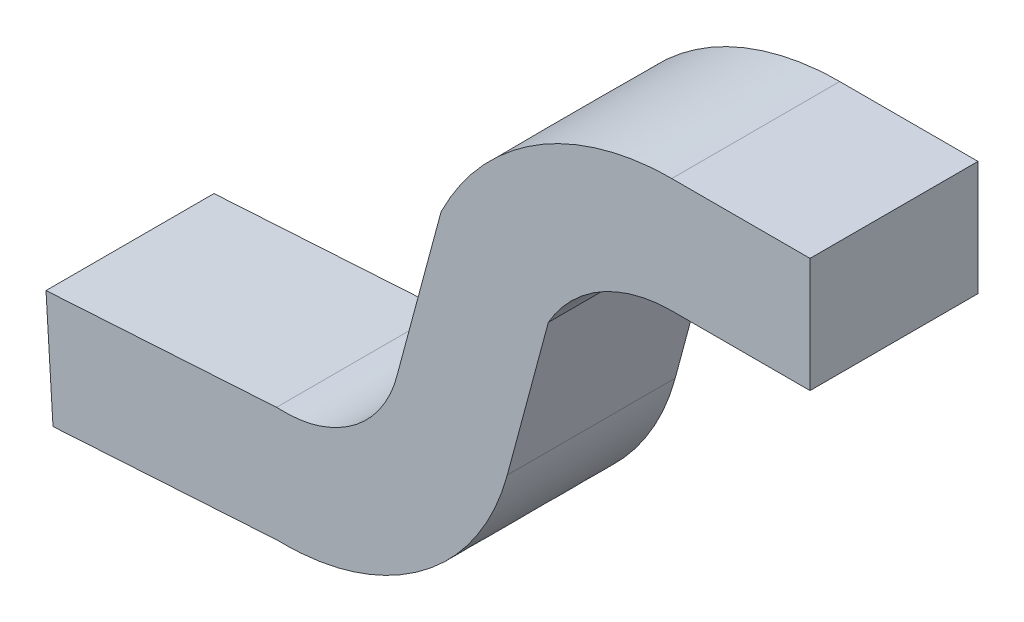
ISO-10303-21;
HEADER;
FILE_DESCRIPTION(('STEP AP214'),'2;1');
FILE_NAME('part.step','',(''),(''),'','','');
FILE_SCHEMA(('AUTOMOTIVE_DESIGN { 1 0 10303 214 1 1 1 1 }'));
ENDSEC;
DATA;
#1=APPLICATION_CONTEXT('core data for automotive mechanical design processes');
#2=APPLICATION_PROTOCOL_DEFINITION('international standard','automotive_design',2000,#1);
#3=PRODUCT_CONTEXT('',#1,'mechanical');
#4=PRODUCT('Part','Part','',(#3));
#5=PRODUCT_RELATED_PRODUCT_CATEGORY('part','',(#4));
#6=PRODUCT_DEFINITION_FORMATION('','',#4);
#7=PRODUCT_DEFINITION_CONTEXT('part definition',#1,'design');
#8=PRODUCT_DEFINITION('design','',#6,#7);
#9=PRODUCT_DEFINITION_SHAPE('','',#8);
#10=(LENGTH_UNIT() NAMED_UNIT(*) SI_UNIT(.MILLI.,.METRE.));
#11=(NAMED_UNIT(*) PLANE_ANGLE_UNIT() SI_UNIT($,.RADIAN.));
#12=(NAMED_UNIT(*) SI_UNIT($,.STERADIAN.) SOLID_ANGLE_UNIT());
#13=UNCERTAINTY_MEASURE_WITH_UNIT(LENGTH_MEASURE(1.E-05),#10,'distance_accuracy_value','');
#14=(GEOMETRIC_REPRESENTATION_CONTEXT(3) GLOBAL_UNCERTAINTY_ASSIGNED_CONTEXT((#13)) GLOBAL_UNIT_ASSIGNED_CONTEXT((#10,
#11,#12)) REPRESENTATION_CONTEXT('',''));
#15=CARTESIAN_POINT('',(0.,0.,0.));
#16=DIRECTION('',(0.,0.,1.));
#17=DIRECTION('',(1.,0.,0.));
#18=AXIS2_PLACEMENT_3D('',#15,#16,#17);
#19=CARTESIAN_POINT('',(78.5226880897937,170.856415940122,-6.12950573779441));
#20=DIRECTION('',(0.,0.,-1.));
#21=DIRECTION('',(0.,1.,0.));
#22=AXIS2_PLACEMENT_3D('',#19,#20,#21);
#23=PLANE('',#22);
#24=DIRECTION('',(1.,0.,0.));
#25=VECTOR('',#24,1.);
#26=CARTESIAN_POINT('',(78.5226880897937,170.931415940122,-6.12950573779441));
#27=LINE('',#26,#25);
#28=CARTESIAN_POINT('',(78.3415946480371,170.931415940122,-6.12950573779441));
#29=VERTEX_POINT('',#28);
#30=CARTESIAN_POINT('',(78.5226880897937,170.931415940122,-6.12950573779441));
#31=VERTEX_POINT('',#30);
#32=EDGE_CURVE('E11',#29,#31,#27,.T.);
#33=ORIENTED_EDGE('',*,*,#32,.T.);
#34=DIRECTION('',(0.,-1.,0.));
#35=VECTOR('',#34,1.);
#36=CARTESIAN_POINT('',(78.5226880897937,170.856415940122,-6.12950573779441));
#37=LINE('',#36,#35);
#38=CARTESIAN_POINT('',(78.5226880897937,170.781415940122,-6.12950573779441));
#39=VERTEX_POINT('',#38);
#40=EDGE_CURVE('E24',#31,#39,#37,.T.);
#41=ORIENTED_EDGE('',*,*,#40,.T.);
#42=DIRECTION('',(-1.,0.,0.));
#43=VECTOR('',#42,1.);
#44=CARTESIAN_POINT('',(78.5226880897937,170.781415940122,-6.12950573779441));
#45=LINE('',#44,#43);
#46=CARTESIAN_POINT('',(78.3415946480371,170.781415940122,-6.12950573779441));
#47=VERTEX_POINT('',#46);
#48=EDGE_CURVE('E229',#39,#47,#45,.T.);
#49=ORIENTED_EDGE('',*,*,#48,.T.);
#50=CARTESIAN_POINT('',(78.3415946480371,170.781415940122,-6.12950573779441));
#51=CARTESIAN_POINT('',(78.3042981197725,170.781414075277,-6.12950573779441));
#52=CARTESIAN_POINT('',(78.2484896964754,170.764039803401,-6.12950573779441));
#53=CARTESIAN_POINT('',(78.2002998553337,170.718899346494,-6.12950573779441));
#54=CARTESIAN_POINT('',(78.1846185340029,170.695647599662,-6.12950573779441));
#55=CARTESIAN_POINT('',(78.1800022248864,170.687554167483,-6.12950573779441));
#56=B_SPLINE_CURVE_WITH_KNOTS('',3,(#50,#51,#52,#53,#54,#55),.UNSPECIFIED.,.F.,.F.,(4,1,1,4),
(0.,0.000111427492817794,0.000167141239226691,0.000194977732850761),.UNSPECIFIED.);
#57=CARTESIAN_POINT('',(78.1800022248864,170.687554167483,-6.12950573779441));
#58=VERTEX_POINT('',#57);
#59=EDGE_CURVE('E107',#47,#58,#56,.T.);
#60=ORIENTED_EDGE('',*,*,#59,.T.);
#61=DIRECTION('',(-0.259594719086982,-0.96571765119115,0.));
#62=VECTOR('',#61,1.);
#63=CARTESIAN_POINT('',(78.1800022248868,170.687554167483,-6.12950573779441));
#64=LINE('',#63,#62);
#65=CARTESIAN_POINT('',(78.1261747724842,170.487310799333,-6.12950573779441));
#66=VERTEX_POINT('',#65);
#67=EDGE_CURVE('E221',#58,#66,#64,.T.);
#68=ORIENTED_EDGE('',*,*,#67,.T.);
#69=CARTESIAN_POINT('',(78.1261747724842,170.487310799333,-6.12950573779441));
#70=CARTESIAN_POINT('',(78.1123684548075,170.435960193964,-6.12950573779441));
#71=CARTESIAN_POINT('',(78.0571183808941,170.340768297939,-6.12950573779441));
#72=CARTESIAN_POINT('',(77.9416095969659,170.274871267781,-6.12950573779441));
#73=CARTESIAN_POINT('',(77.860457715033,170.262996869224,-6.12950573779441));
#74=CARTESIAN_POINT('',(77.8322742532096,170.26282421348,-6.12950573779441));
#75=CARTESIAN_POINT('',(77.8260467640054,170.262986503566,-6.12950573779441));
#76=B_SPLINE_CURVE_WITH_KNOTS('',3,(#69,#70,#71,#72,#73,#74,#75),.UNSPECIFIED.,.F.,.F.,(4,1,1,1,
4),(0.,0.000158251289515171,0.000316502579030343,0.000382440616328329,0.000400819627833276),.UNSPECIFIED.);
#77=CARTESIAN_POINT('',(77.8260467640054,170.262986503566,-6.12950573779441));
#78=VERTEX_POINT('',#77);
#79=EDGE_CURVE('E217',#66,#78,#76,.T.);
#80=ORIENTED_EDGE('',*,*,#79,.T.);
#81=DIRECTION('',(-0.998127571010503,-0.0611665920962821,0.));
#82=VECTOR('',#81,1.);
#83=CARTESIAN_POINT('',(77.8260467640054,170.262986503566,-6.12950573779441));
#84=LINE('',#83,#82);
#85=CARTESIAN_POINT('',(77.5312616545398,170.244921677916,-6.12950573779441));
#86=VERTEX_POINT('',#85);
#87=EDGE_CURVE('E215',#78,#86,#84,.T.);
#88=ORIENTED_EDGE('',*,*,#87,.T.);
#89=DIRECTION('',(-0.0611665920952304,0.998127571010568,0.));
#90=VECTOR('',#89,1.);
#91=CARTESIAN_POINT('',(77.5312616545398,170.244921677916,-6.12950573779441));
#92=LINE('',#91,#90);
#93=CARTESIAN_POINT('',(77.5220866657255,170.394640813568,-6.12950573779441));
#94=VERTEX_POINT('',#93);
#95=EDGE_CURVE('E213',#86,#94,#92,.T.);
#96=ORIENTED_EDGE('',*,*,#95,.T.);
#97=DIRECTION('',(0.998127571092735,0.0611665907544149,0.));
#98=VECTOR('',#97,1.);
#99=CARTESIAN_POINT('',(77.5220866657255,170.394640813568,-6.12950573779441));
#100=LINE('',#99,#98);
#101=CARTESIAN_POINT('',(77.8240100499531,170.41314299896,-6.12950573779441));
#102=VERTEX_POINT('',#101);
#103=EDGE_CURVE('E208',#94,#102,#100,.T.);
#104=ORIENTED_EDGE('',*,*,#103,.T.);
#105=CARTESIAN_POINT('',(77.8240100499531,170.41314299896,-6.12950573779441));
#106=CARTESIAN_POINT('',(77.8242219500949,170.413134996069,-6.12950573779441));
#107=CARTESIAN_POINT('',(77.8252879928291,170.413094870281,-6.12950573779441));
#108=CARTESIAN_POINT('',(77.8272233767786,170.413021999492,-6.12950573779442));
#109=CARTESIAN_POINT('',(77.8315741561614,170.412864903467,-6.12950573779442));
#110=CARTESIAN_POINT('',(77.8468637642026,170.412912094523,-6.12950573779442));
#111=CARTESIAN_POINT('',(77.8880913868406,170.4189446499,-6.12950573779442));
#112=CARTESIAN_POINT('',(77.9464360425557,170.452229906735,-6.12950573779442));
#113=CARTESIAN_POINT('',(77.9743434140214,170.500312296736,-6.12950573779442));
#114=CARTESIAN_POINT('',(77.9813171248052,170.526250007196,-6.12950573779441));
#115=B_SPLINE_CURVE_WITH_KNOTS('',3,(#105,#106,#107,#108,#109,#110,#111,#112,#113,#114),
.UNSPECIFIED.,.F.,.F.,(4,1,1,1,1,1,1,4),(1.50722081371823E-12,4.17123673145532E-07,
2.09534026869082E-06,3.77355686423462E-06,1.38428564374988E-05,4.74071883483789E-05,
0.000127961584934494,0.000208515981520608),.UNSPECIFIED.);
#116=CARTESIAN_POINT('',(77.9813171248052,170.526250007196,-6.12950573779441));
#117=VERTEX_POINT('',#116);
#118=EDGE_CURVE('E204',#102,#117,#115,.T.);
#119=ORIENTED_EDGE('',*,*,#118,.T.);
#120=DIRECTION('',(0.259594719083103,0.965717651192192,0.));
#121=VECTOR('',#120,1.);
#122=CARTESIAN_POINT('',(77.9813171248053,170.526250007196,-6.12950573779441));
#123=LINE('',#122,#121);
#124=CARTESIAN_POINT('',(78.039541754191,170.742851302209,-6.12950573779441));
#125=VERTEX_POINT('',#124);
#126=EDGE_CURVE('E199',#117,#125,#123,.T.);
#127=ORIENTED_EDGE('',*,*,#126,.T.);
#128=CARTESIAN_POINT('',(78.039541754191,170.742851302209,-6.12950573779441));
#129=CARTESIAN_POINT('',(78.0397513449047,170.743255530311,-6.12950573779441));
#130=CARTESIAN_POINT('',(78.0407137163824,170.74511161252,-6.12950573779441));
#131=CARTESIAN_POINT('',(78.0416760878598,170.74696769473,-6.12950573779441));
#132=CARTESIAN_POINT('',(78.0435580397641,170.750597329989,-6.12950573779441));
#133=CARTESIAN_POINT('',(78.0450990170632,170.753551170952,-6.12950573779441));
#134=CARTESIAN_POINT('',(78.0556852655541,170.772957119384,-6.12950573779441));
#135=CARTESIAN_POINT('',(78.0941117166191,170.831147292429,-6.12950573779441));
#136=CARTESIAN_POINT('',(78.1900520686917,170.908230080889,-6.12950573779441));
#137=CARTESIAN_POINT('',(78.291067462068,170.931413413761,-6.12950573779441));
#138=CARTESIAN_POINT('',(78.3415946480371,170.931415940122,-6.12950573779441));
#139=B_SPLINE_CURVE_WITH_KNOTS('',3,(#128,#129,#130,#131,#132,#133,#134,#135,#136,#137,#138),
.UNSPECIFIED.,.F.,.F.,(4,1,2,2,1,1,4),(0.,1.73943204032796E-06,7.98689851016885E-06,
1.73580982149335E-05,7.35852964435088E-05,0.000223524491719711,0.000373463686995914),.UNSPECIFIED.);
#140=EDGE_CURVE('E195',#125,#29,#139,.T.);
#141=ORIENTED_EDGE('',*,*,#140,.T.);
#142=EDGE_LOOP('',(#33,#41,#49,#60,#68,#80,#88,#96,#104,#119,#127,#141));
#143=FACE_BOUND('',#142,.T.);
#144=ADVANCED_FACE('F17',(#143),#23,.T.);
#145=CARTESIAN_POINT('',(78.5226880897937,170.856415940122,-6.01950573779441));
#146=DIRECTION('',(-1.,0.,0.));
#147=DIRECTION('',(0.,-1.,0.));
#148=AXIS2_PLACEMENT_3D('',#145,#146,#147);
#149=PLANE('',#148);
#150=DIRECTION('',(0.,1.,0.));
#151=VECTOR('',#150,1.);
#152=CARTESIAN_POINT('',(78.5226880897937,170.856415940122,-5.90950573779441));
#153=LINE('',#152,#151);
#154=CARTESIAN_POINT('',(78.5226880897937,170.781415940122,-5.90950573779441));
#155=VERTEX_POINT('',#154);
#156=CARTESIAN_POINT('',(78.5226880897937,170.931415940122,-5.90950573779441));
#157=VERTEX_POINT('',#156);
#158=EDGE_CURVE('E193',#155,#157,#153,.T.);
#159=ORIENTED_EDGE('',*,*,#158,.F.);
#160=DIRECTION('',(0.,0.,1.));
#161=VECTOR('',#160,1.);
#162=CARTESIAN_POINT('',(78.5226880897937,170.781415940122,-6.01950573779441));
#163=LINE('',#162,#161);
#164=EDGE_CURVE('E124',#39,#155,#163,.T.);
#165=ORIENTED_EDGE('',*,*,#164,.F.);
#166=ORIENTED_EDGE('',*,*,#40,.F.);
#167=DIRECTION('',(0.,0.,-1.));
#168=VECTOR('',#167,1.);
#169=CARTESIAN_POINT('',(78.5226880897937,170.931415940122,-6.01950573779441));
#170=LINE('',#169,#168);
#171=EDGE_CURVE('E190',#157,#31,#170,.T.);
#172=ORIENTED_EDGE('',*,*,#171,.F.);
#173=EDGE_LOOP('',(#159,#165,#166,#172));
#174=FACE_BOUND('',#173,.T.);
#175=ADVANCED_FACE('F235',(#174),#149,.F.);
#176=CARTESIAN_POINT('',(78.5226880897937,170.931415940122,-6.01950573779441));
#177=DIRECTION('',(0.,1.,0.));
#178=DIRECTION('',(0.,0.,1.));
#179=AXIS2_PLACEMENT_3D('',#176,#177,#178);
#180=PLANE('',#179);
#181=ORIENTED_EDGE('',*,*,#171,.T.);
#182=ORIENTED_EDGE('',*,*,#32,.F.);
#183=DIRECTION('',(0.,0.,1.));
#184=VECTOR('',#183,1.);
#185=CARTESIAN_POINT('',(78.3415946480371,170.931415940122,-6.01950573779441));
#186=LINE('',#185,#184);
#187=CARTESIAN_POINT('',(78.3415946480371,170.931415940122,-5.90950573779441));
#188=VERTEX_POINT('',#187);
#189=EDGE_CURVE('E188',#29,#188,#186,.T.);
#190=ORIENTED_EDGE('',*,*,#189,.T.);
#191=DIRECTION('',(1.,0.,0.));
#192=VECTOR('',#191,1.);
#193=CARTESIAN_POINT('',(78.5226880897937,170.931415940122,-5.90950573779441));
#194=LINE('',#193,#192);
#195=EDGE_CURVE('E185',#188,#157,#194,.T.);
#196=ORIENTED_EDGE('',*,*,#195,.T.);
#197=EDGE_LOOP('',(#181,#182,#190,#196));
#198=FACE_BOUND('',#197,.T.);
#199=ADVANCED_FACE('F288',(#198),#180,.T.);
#200=CARTESIAN_POINT('',(78.3415946480371,170.931415940122,-5.90950573779441));
#201=CARTESIAN_POINT('',(78.291067462068,170.931413413761,-5.90950573779441));
#202=CARTESIAN_POINT('',(78.1900520686917,170.908230080889,-5.90950573779441));
#203=CARTESIAN_POINT('',(78.0941117166191,170.831147292429,-5.90950573779441));
#204=CARTESIAN_POINT('',(78.0556852655541,170.772957119384,-5.90950573779441));
#205=CARTESIAN_POINT('',(78.0450990170632,170.753551170952,-5.90950573779441));
#206=CARTESIAN_POINT('',(78.0435580397641,170.750597329989,-5.90950573779441));
#207=CARTESIAN_POINT('',(78.0416760878598,170.74696769473,-5.90950573779441));
#208=CARTESIAN_POINT('',(78.0375357936752,170.738982497164,-5.90950573779441));
#209=CARTESIAN_POINT('',(78.0333954994857,170.730997299598,-5.90950573779441));
#210=CARTESIAN_POINT('',(78.0300079860621,170.724463956132,-5.90950573779441));
#211=CARTESIAN_POINT('',(78.3415946480371,170.931415940122,-5.98283907112774));
#212=CARTESIAN_POINT('',(78.291067462068,170.931413413761,-5.98283907112774));
#213=CARTESIAN_POINT('',(78.1900520686917,170.908230080889,-5.98283907112774));
#214=CARTESIAN_POINT('',(78.0941117166191,170.831147292429,-5.98283907112774));
#215=CARTESIAN_POINT('',(78.0556852655541,170.772957119384,-5.98283907112774));
#216=CARTESIAN_POINT('',(78.0450990170632,170.753551170952,-5.98283907112774));
#217=CARTESIAN_POINT('',(78.0435580397641,170.750597329989,-5.98283907112774));
#218=CARTESIAN_POINT('',(78.0416760878598,170.74696769473,-5.98283907112774));
#219=CARTESIAN_POINT('',(78.0375357936752,170.738982497164,-5.98283907112774));
#220=CARTESIAN_POINT('',(78.0333954994857,170.730997299598,-5.98283907112774));
#221=CARTESIAN_POINT('',(78.0300079860621,170.724463956132,-5.98283907112774));
#222=CARTESIAN_POINT('',(78.3415946480371,170.931415940122,-6.05617240446108));
#223=CARTESIAN_POINT('',(78.291067462068,170.931413413761,-6.05617240446108));
#224=CARTESIAN_POINT('',(78.1900520686917,170.908230080889,-6.05617240446108));
#225=CARTESIAN_POINT('',(78.0941117166191,170.831147292429,-6.05617240446108));
#226=CARTESIAN_POINT('',(78.0556852655541,170.772957119384,-6.05617240446108));
#227=CARTESIAN_POINT('',(78.0450990170632,170.753551170952,-6.05617240446108));
#228=CARTESIAN_POINT('',(78.0435580397641,170.750597329989,-6.05617240446108));
#229=CARTESIAN_POINT('',(78.0416760878598,170.74696769473,-6.05617240446108));
#230=CARTESIAN_POINT('',(78.0375357936752,170.738982497164,-6.05617240446108));
#231=CARTESIAN_POINT('',(78.0333954994857,170.730997299598,-6.05617240446108));
#232=CARTESIAN_POINT('',(78.0300079860621,170.724463956132,-6.05617240446108));
#233=CARTESIAN_POINT('',(78.3415946480371,170.931415940122,-6.12950573779441));
#234=CARTESIAN_POINT('',(78.291067462068,170.931413413761,-6.12950573779441));
#235=CARTESIAN_POINT('',(78.1900520686917,170.908230080889,-6.12950573779441));
#236=CARTESIAN_POINT('',(78.0941117166191,170.831147292429,-6.12950573779441));
#237=CARTESIAN_POINT('',(78.0556852655541,170.772957119384,-6.12950573779441));
#238=CARTESIAN_POINT('',(78.0450990170632,170.753551170952,-6.12950573779441));
#239=CARTESIAN_POINT('',(78.0435580397641,170.750597329989,-6.12950573779441));
#240=CARTESIAN_POINT('',(78.0416760878598,170.74696769473,-6.12950573779441));
#241=CARTESIAN_POINT('',(78.0375357936752,170.738982497164,-6.12950573779441));
#242=CARTESIAN_POINT('',(78.0333954994857,170.730997299598,-6.12950573779441));
#243=CARTESIAN_POINT('',(78.0300079860621,170.724463956132,-6.12950573779441));
#244=B_SPLINE_SURFACE_WITH_KNOTS('',3,3,((#200,#201,#202,#203,#204,#205,#206,#207,#208,#209,
#210),(#211,#212,#213,#214,#215,#216,#217,#218,#219,#220,#221),(#222,#223,#224,#225,#226,#227,
#228,#229,#230,#231,#232),(#233,#234,#235,#236,#237,#238,#239,#240,#241,#242,#243)),
.UNSPECIFIED.,.F.,.F.,.F.,(4,4),(4,1,1,2,2,1,4),(-0.219999999999999,0.),(0.,0.451095796551424,
0.902191593102848,1.07135251680963,1.0995460040941,1.11834166228374,1.20292212413713),.UNSPECIFIED.);
#245=DIRECTION('',(0.,0.,1.));
#246=VECTOR('',#245,1.);
#247=CARTESIAN_POINT('',(78.0395417541913,170.74285130221,-6.01950573779441));
#248=LINE('',#247,#246);
#249=CARTESIAN_POINT('',(78.039541754191,170.742851302209,-5.90950573779441));
#250=VERTEX_POINT('',#249);
#251=EDGE_CURVE('E180',#125,#250,#248,.T.);
#252=CARTESIAN_POINT('',(78.039541754191,170.742851302209,-5.90950573779441));
#253=CARTESIAN_POINT('',(78.0397513449047,170.743255530311,-5.9095057377944));
#254=CARTESIAN_POINT('',(78.0407137163823,170.74511161252,-5.9095057377944));
#255=CARTESIAN_POINT('',(78.0416760878598,170.74696769473,-5.9095057377944));
#256=CARTESIAN_POINT('',(78.0435580397641,170.750597329989,-5.9095057377944));
#257=CARTESIAN_POINT('',(78.0450990170632,170.753551170952,-5.9095057377944));
#258=CARTESIAN_POINT('',(78.0556852655541,170.772957119384,-5.9095057377944));
#259=CARTESIAN_POINT('',(78.0941117166191,170.831147292429,-5.9095057377944));
#260=CARTESIAN_POINT('',(78.1900520686917,170.908230080889,-5.9095057377944));
#261=CARTESIAN_POINT('',(78.291067462068,170.931413413761,-5.9095057377944));
#262=CARTESIAN_POINT('',(78.3415946480371,170.931415940122,-5.90950573779441));
#263=B_SPLINE_CURVE_WITH_KNOTS('',3,(#252,#253,#254,#255,#256,#257,#258,#259,#260,#261,#262),
.UNSPECIFIED.,.F.,.F.,(4,1,2,2,1,1,4),(0.,1.73943204034298E-06,7.9868985101836E-06,
1.73580982149479E-05,7.35852964435207E-05,0.000223524491719717,0.000373463686995913),.UNSPECIFIED.);
#264=EDGE_CURVE('E175',#250,#188,#263,.T.);
#265=ORIENTED_EDGE('',*,*,#189,.F.);
#266=ORIENTED_EDGE('',*,*,#140,.F.);
#267=ORIENTED_EDGE('',*,*,#251,.T.);
#268=ORIENTED_EDGE('',*,*,#264,.T.);
#269=EDGE_LOOP('',(#265,#266,#267,#268));
#270=FACE_BOUND('',#269,.T.);
#271=ADVANCED_FACE('F241',(#270),#244,.T.);
#272=CARTESIAN_POINT('',(78.0449184818087,170.762853252882,-6.01950573779441));
#273=DIRECTION('',(-0.965717651192185,0.259594719083132,0.));
#274=DIRECTION('',(-0.259594719083132,-0.965717651192185,0.));
#275=AXIS2_PLACEMENT_3D('',#272,#273,#274);
#276=PLANE('',#275);
#277=DIRECTION('',(0.,0.,1.));
#278=VECTOR('',#277,1.);
#279=CARTESIAN_POINT('',(77.9813171248052,170.526250007196,-6.01950573779441));
#280=LINE('',#279,#278);
#281=CARTESIAN_POINT('',(77.9813171248052,170.526250007196,-5.90950573779441));
#282=VERTEX_POINT('',#281);
#283=EDGE_CURVE('E173',#117,#282,#280,.T.);
#284=ORIENTED_EDGE('',*,*,#283,.T.);
#285=DIRECTION('',(0.259594719083132,0.965717651192184,0.));
#286=VECTOR('',#285,1.);
#287=CARTESIAN_POINT('',(78.0449184818087,170.762853252882,-5.90950573779441));
#288=LINE('',#287,#286);
#289=EDGE_CURVE('E170',#282,#250,#288,.T.);
#290=ORIENTED_EDGE('',*,*,#289,.T.);
#291=ORIENTED_EDGE('',*,*,#251,.F.);
#292=ORIENTED_EDGE('',*,*,#126,.F.);
#293=EDGE_LOOP('',(#284,#290,#291,#292));
#294=FACE_BOUND('',#293,.T.);
#295=ADVANCED_FACE('F246',(#294),#276,.T.);
#296=CARTESIAN_POINT('',(77.9813171248053,170.526250007196,-5.90950573779441));
#297=CARTESIAN_POINT('',(77.9743434140214,170.500312296736,-5.90950573779441));
#298=CARTESIAN_POINT('',(77.9464360425557,170.452229906735,-5.90950573779441));
#299=CARTESIAN_POINT('',(77.8880913868406,170.4189446499,-5.90950573779441));
#300=CARTESIAN_POINT('',(77.8468637642026,170.412912094523,-5.90950573779441));
#301=CARTESIAN_POINT('',(77.8315741561614,170.412864903467,-5.90950573779441));
#302=CARTESIAN_POINT('',(77.8272233767786,170.413021999492,-5.90950573779441));
#303=CARTESIAN_POINT('',(77.8220590267339,170.413216446832,-5.90950573779441));
#304=CARTESIAN_POINT('',(77.8178935812234,170.413373079992,-5.90950573779441));
#305=CARTESIAN_POINT('',(77.8145612248143,170.413498386523,-5.90950573779441));
#306=CARTESIAN_POINT('',(77.9813171248053,170.526250007196,-5.98283907112774));
#307=CARTESIAN_POINT('',(77.9743434140214,170.500312296736,-5.98283907112774));
#308=CARTESIAN_POINT('',(77.9464360425557,170.452229906735,-5.98283907112774));
#309=CARTESIAN_POINT('',(77.8880913868406,170.4189446499,-5.98283907112774));
#310=CARTESIAN_POINT('',(77.8468637642026,170.412912094523,-5.98283907112774));
#311=CARTESIAN_POINT('',(77.8315741561614,170.412864903467,-5.98283907112774));
#312=CARTESIAN_POINT('',(77.8272233767786,170.413021999492,-5.98283907112774));
#313=CARTESIAN_POINT('',(77.8220590267339,170.413216446832,-5.98283907112774));
#314=CARTESIAN_POINT('',(77.8178935812234,170.413373079992,-5.98283907112774));
#315=CARTESIAN_POINT('',(77.8145612248143,170.413498386523,-5.98283907112774));
#316=CARTESIAN_POINT('',(77.9813171248053,170.526250007196,-6.05617240446108));
#317=CARTESIAN_POINT('',(77.9743434140214,170.500312296736,-6.05617240446108));
#318=CARTESIAN_POINT('',(77.9464360425557,170.452229906735,-6.05617240446108));
#319=CARTESIAN_POINT('',(77.8880913868406,170.4189446499,-6.05617240446108));
#320=CARTESIAN_POINT('',(77.8468637642026,170.412912094523,-6.05617240446108));
#321=CARTESIAN_POINT('',(77.8315741561614,170.412864903467,-6.05617240446108));
#322=CARTESIAN_POINT('',(77.8272233767786,170.413021999492,-6.05617240446108));
#323=CARTESIAN_POINT('',(77.8220590267339,170.413216446832,-6.05617240446108));
#324=CARTESIAN_POINT('',(77.8178935812234,170.413373079992,-6.05617240446108));
#325=CARTESIAN_POINT('',(77.8145612248143,170.413498386523,-6.05617240446108));
#326=CARTESIAN_POINT('',(77.9813171248053,170.526250007196,-6.12950573779441));
#327=CARTESIAN_POINT('',(77.9743434140214,170.500312296736,-6.12950573779441));
#328=CARTESIAN_POINT('',(77.9464360425557,170.452229906735,-6.12950573779441));
#329=CARTESIAN_POINT('',(77.8880913868406,170.4189446499,-6.12950573779441));
#330=CARTESIAN_POINT('',(77.8468637642026,170.412912094523,-6.12950573779441));
#331=CARTESIAN_POINT('',(77.8315741561614,170.412864903467,-6.12950573779441));
#332=CARTESIAN_POINT('',(77.8272233767786,170.413021999492,-6.12950573779441));
#333=CARTESIAN_POINT('',(77.8220590267339,170.413216446832,-6.12950573779441));
#334=CARTESIAN_POINT('',(77.8178935812234,170.413373079992,-6.12950573779441));
#335=CARTESIAN_POINT('',(77.8145612248143,170.413498386523,-6.12950573779441));
#336=B_SPLINE_SURFACE_WITH_KNOTS('',3,3,((#296,#297,#298,#299,#300,#301,#302,#303,#304,#305),
(#306,#307,#308,#309,#310,#311,#312,#313,#314,#315),(#316,#317,#318,#319,#320,#321,#322,#323,
#324,#325),(#326,#327,#328,#329,#330,#331,#332,#333,#334,#335)),.UNSPECIFIED.,.F.,.F.,.F.,(4,4),
(4,1,1,1,1,1,1,4),(-0.219999999999999,0.),(0.,0.526307798376563,1.05261559675313,
1.27191051274336,1.33769898754043,1.34866373333994,1.35962847913946,1.4034874623375),.UNSPECIFIED.);
#337=DIRECTION('',(0.,0.,1.));
#338=VECTOR('',#337,1.);
#339=CARTESIAN_POINT('',(77.8240100516397,170.41314297144,-6.01950573779441));
#340=LINE('',#339,#338);
#341=CARTESIAN_POINT('',(77.8240100537065,170.413143027018,-5.90950573779441));
#342=VERTEX_POINT('',#341);
#343=EDGE_CURVE('E165',#102,#342,#340,.T.);
#344=CARTESIAN_POINT('',(77.8240100537065,170.413143027018,-5.90950573779441));
#345=CARTESIAN_POINT('',(77.8242219500882,170.41313499607,-5.90950573779441));
#346=CARTESIAN_POINT('',(77.8252879928257,170.413094870281,-5.90950573779441));
#347=CARTESIAN_POINT('',(77.8272233767786,170.413021999492,-5.90950573779441));
#348=CARTESIAN_POINT('',(77.8315741561613,170.412864903467,-5.90950573779441));
#349=CARTESIAN_POINT('',(77.8468637642026,170.412912094523,-5.90950573779441));
#350=CARTESIAN_POINT('',(77.8880913868406,170.4189446499,-5.90950573779441));
#351=CARTESIAN_POINT('',(77.9464360425557,170.452229906735,-5.90950573779441));
#352=CARTESIAN_POINT('',(77.9743434140214,170.500312296736,-5.90950573779441));
#353=CARTESIAN_POINT('',(77.9813171248052,170.526250007196,-5.90950573779441));
#354=B_SPLINE_CURVE_WITH_KNOTS('',3,(#344,#345,#346,#347,#348,#349,#350,#351,#352,#353),
.UNSPECIFIED.,.F.,.F.,(4,1,1,1,1,1,1,4),(8.48981973280288E-12,4.17130648320779E-07,
2.09534718769076E-06,3.77356372705924E-06,1.38428629632715E-05,4.74071937506454E-05,
0.000127961587640345,0.000208515981530044),.UNSPECIFIED.);
#355=EDGE_CURVE('E160',#342,#282,#354,.T.);
#356=ORIENTED_EDGE('',*,*,#283,.F.);
#357=ORIENTED_EDGE('',*,*,#118,.F.);
#358=ORIENTED_EDGE('',*,*,#343,.T.);
#359=ORIENTED_EDGE('',*,*,#355,.T.);
#360=EDGE_LOOP('',(#356,#357,#358,#359));
#361=FACE_BOUND('',#360,.T.);
#362=ADVANCED_FACE('F251',(#361),#336,.T.);
#363=CARTESIAN_POINT('',(77.8334478544399,170.413721443517,-6.01950573779441));
#364=DIRECTION('',(-0.0611665920952571,0.998127571010566,0.));
#365=DIRECTION('',(-0.998127571010566,-0.0611665920952571,0.));
#366=AXIS2_PLACEMENT_3D('',#363,#364,#365);
#367=PLANE('',#366);
#368=DIRECTION('',(0.,0.,1.));
#369=VECTOR('',#368,1.);
#370=CARTESIAN_POINT('',(77.5220866657255,170.394640813568,-6.01950573779441));
#371=LINE('',#370,#369);
#372=CARTESIAN_POINT('',(77.5220866657255,170.394640813568,-5.90950573779441));
#373=VERTEX_POINT('',#372);
#374=EDGE_CURVE('E158',#94,#373,#371,.T.);
#375=ORIENTED_EDGE('',*,*,#374,.T.);
#376=DIRECTION('',(0.998127571010566,0.0611665920952571,0.));
#377=VECTOR('',#376,1.);
#378=CARTESIAN_POINT('',(77.8334478544399,170.413721443517,-5.90950573779441));
#379=LINE('',#378,#377);
#380=EDGE_CURVE('E155',#373,#342,#379,.T.);
#381=ORIENTED_EDGE('',*,*,#380,.T.);
#382=ORIENTED_EDGE('',*,*,#343,.F.);
#383=ORIENTED_EDGE('',*,*,#103,.F.);
#384=EDGE_LOOP('',(#375,#381,#382,#383));
#385=FACE_BOUND('',#384,.T.);
#386=ADVANCED_FACE('F256',(#385),#367,.T.);
#387=CARTESIAN_POINT('',(77.5266741601326,170.319781245742,-6.01950573779444));
#388=DIRECTION('',(-0.998127571010566,-0.0611665920952571,0.));
#389=DIRECTION('',(0.0611665920952571,-0.998127571010566,0.));
#390=AXIS2_PLACEMENT_3D('',#387,#388,#389);
#391=PLANE('',#390);
#392=ORIENTED_EDGE('',*,*,#95,.F.);
#393=DIRECTION('',(0.,0.,1.));
#394=VECTOR('',#393,1.);
#395=CARTESIAN_POINT('',(77.5312616545398,170.244921677916,-6.01950573779444));
#396=LINE('',#395,#394);
#397=CARTESIAN_POINT('',(77.5312616545397,170.244921677916,-5.90950573779441));
#398=VERTEX_POINT('',#397);
#399=EDGE_CURVE('E153',#86,#398,#396,.T.);
#400=ORIENTED_EDGE('',*,*,#399,.T.);
#401=DIRECTION('',(-0.0611665920952571,0.998127571010566,0.));
#402=VECTOR('',#401,1.);
#403=CARTESIAN_POINT('',(77.5266741601326,170.319781245742,-5.90950573779441));
#404=LINE('',#403,#402);
#405=EDGE_CURVE('E150',#398,#373,#404,.T.);
#406=ORIENTED_EDGE('',*,*,#405,.T.);
#407=ORIENTED_EDGE('',*,*,#374,.F.);
#408=EDGE_LOOP('',(#392,#400,#406,#407));
#409=FACE_BOUND('',#408,.T.);
#410=ADVANCED_FACE('F262',(#409),#391,.T.);
#411=CARTESIAN_POINT('',(77.8426228432542,170.264002307865,-6.01950573779441));
#412=DIRECTION('',(0.0611665920952571,-0.998127571010566,0.));
#413=DIRECTION('',(0.998127571010566,0.0611665920952571,0.));
#414=AXIS2_PLACEMENT_3D('',#411,#412,#413);
#415=PLANE('',#414);
#416=ORIENTED_EDGE('',*,*,#399,.F.);
#417=ORIENTED_EDGE('',*,*,#87,.F.);
#418=DIRECTION('',(0.,0.,1.));
#419=VECTOR('',#418,1.);
#420=CARTESIAN_POINT('',(77.8260467640054,170.262986503566,-6.01950573779441));
#421=LINE('',#420,#419);
#422=CARTESIAN_POINT('',(77.8260467393729,170.262985547071,-5.90950573779441));
#423=VERTEX_POINT('',#422);
#424=EDGE_CURVE('E148',#78,#423,#421,.T.);
#425=ORIENTED_EDGE('',*,*,#424,.T.);
#426=DIRECTION('',(-0.998127571010566,-0.0611665920952571,0.));
#427=VECTOR('',#426,1.);
#428=CARTESIAN_POINT('',(77.8426228432542,170.264002307865,-5.90950573779441));
#429=LINE('',#428,#427);
#430=EDGE_CURVE('E145',#423,#398,#429,.T.);
#431=ORIENTED_EDGE('',*,*,#430,.T.);
#432=EDGE_LOOP('',(#416,#417,#425,#431));
#433=FACE_BOUND('',#432,.T.);
#434=ADVANCED_FACE('F266',(#433),#415,.T.);
#435=CARTESIAN_POINT('',(78.1261747724842,170.487310799333,-6.12950573779441));
#436=CARTESIAN_POINT('',(78.1123684548075,170.435960193964,-6.12950573779441));
#437=CARTESIAN_POINT('',(78.0571183808941,170.340768297939,-6.12950573779441));
#438=CARTESIAN_POINT('',(77.9416095969659,170.274871267781,-6.12950573779441));
#439=CARTESIAN_POINT('',(77.8599885384934,170.262928217837,-6.12950573779441));
#440=CARTESIAN_POINT('',(77.830234747442,170.262815385193,-6.12950573779441));
#441=CARTESIAN_POINT('',(77.8212552474875,170.263140160307,-6.12950573779441));
#442=CARTESIAN_POINT('',(77.8164225633665,170.263322383305,-6.12950573779441));
#443=CARTESIAN_POINT('',(77.812257117856,170.263479016465,-6.12950573779441));
#444=CARTESIAN_POINT('',(77.8089247614469,170.263604322996,-6.12950573779441));
#445=CARTESIAN_POINT('',(78.1261747724842,170.487310799333,-6.05617240446108));
#446=CARTESIAN_POINT('',(78.1123684548075,170.435960193964,-6.05617240446108));
#447=CARTESIAN_POINT('',(78.0571183808941,170.340768297939,-6.05617240446108));
#448=CARTESIAN_POINT('',(77.9416095969659,170.274871267781,-6.05617240446108));
#449=CARTESIAN_POINT('',(77.8599885384934,170.262928217837,-6.05617240446108));
#450=CARTESIAN_POINT('',(77.830234747442,170.262815385193,-6.05617240446108));
#451=CARTESIAN_POINT('',(77.8212552474875,170.263140160307,-6.05617240446108));
#452=CARTESIAN_POINT('',(77.8164225633665,170.263322383305,-6.05617240446108));
#453=CARTESIAN_POINT('',(77.812257117856,170.263479016465,-6.05617240446108));
#454=CARTESIAN_POINT('',(77.8089247614469,170.263604322996,-6.05617240446108));
#455=CARTESIAN_POINT('',(78.1261747724842,170.487310799333,-5.98283907112774));
#456=CARTESIAN_POINT('',(78.1123684548075,170.435960193964,-5.98283907112774));
#457=CARTESIAN_POINT('',(78.0571183808941,170.340768297939,-5.98283907112774));
#458=CARTESIAN_POINT('',(77.9416095969659,170.274871267781,-5.98283907112774));
#459=CARTESIAN_POINT('',(77.8599885384934,170.262928217837,-5.98283907112774));
#460=CARTESIAN_POINT('',(77.830234747442,170.262815385193,-5.98283907112774));
#461=CARTESIAN_POINT('',(77.8212552474875,170.263140160307,-5.98283907112774));
#462=CARTESIAN_POINT('',(77.8164225633665,170.263322383305,-5.98283907112774));
#463=CARTESIAN_POINT('',(77.812257117856,170.263479016465,-5.98283907112774));
#464=CARTESIAN_POINT('',(77.8089247614469,170.263604322996,-5.98283907112774));
#465=CARTESIAN_POINT('',(78.1261747724842,170.487310799333,-5.90950573779441));
#466=CARTESIAN_POINT('',(78.1123684548075,170.435960193964,-5.90950573779441));
#467=CARTESIAN_POINT('',(78.0571183808941,170.340768297939,-5.90950573779441));
#468=CARTESIAN_POINT('',(77.9416095969659,170.274871267781,-5.90950573779441));
#469=CARTESIAN_POINT('',(77.8599885384934,170.262928217837,-5.90950573779441));
#470=CARTESIAN_POINT('',(77.830234747442,170.262815385193,-5.90950573779441));
#471=CARTESIAN_POINT('',(77.8212552474875,170.263140160307,-5.90950573779441));
#472=CARTESIAN_POINT('',(77.8164225633665,170.263322383305,-5.90950573779441));
#473=CARTESIAN_POINT('',(77.812257117856,170.263479016465,-5.90950573779441));
#474=CARTESIAN_POINT('',(77.8089247614469,170.263604322996,-5.90950573779441));
#475=B_SPLINE_SURFACE_WITH_KNOTS('',3,3,((#435,#436,#437,#438,#439,#440,#441,#442,#443,#444),
(#445,#446,#447,#448,#449,#450,#451,#452,#453,#454),(#455,#456,#457,#458,#459,#460,#461,#462,
#463,#464),(#465,#466,#467,#468,#469,#470,#471,#472,#473,#474)),.UNSPECIFIED.,.F.,.F.,.F.,(4,4),
(4,1,1,1,1,1,1,4),(-0.219999999999999,0.),(0.,0.526307798376563,1.05261559675313,
1.27191051274336,1.33769898754043,1.34866373333994,1.35962847913946,1.4034874623375),.UNSPECIFIED.);
#476=DIRECTION('',(0.,0.,1.));
#477=VECTOR('',#476,1.);
#478=CARTESIAN_POINT('',(78.1261747724842,170.487310799333,-6.01950573779441));
#479=LINE('',#478,#477);
#480=CARTESIAN_POINT('',(78.1261747724841,170.487310799333,-5.90950573779441));
#481=VERTEX_POINT('',#480);
#482=EDGE_CURVE('E140',#66,#481,#479,.T.);
#483=CARTESIAN_POINT('',(78.1261747724841,170.487310799333,-5.90950573779441));
#484=CARTESIAN_POINT('',(78.1123684548075,170.435960193964,-5.90950573779441));
#485=CARTESIAN_POINT('',(78.0571183808941,170.340768297939,-5.90950573779441));
#486=CARTESIAN_POINT('',(77.9416095969659,170.274871267781,-5.90950573779441));
#487=CARTESIAN_POINT('',(77.860457715033,170.262996869224,-5.90950573779441));
#488=CARTESIAN_POINT('',(77.8322742532097,170.26282421348,-5.90950573779441));
#489=CARTESIAN_POINT('',(77.8260467393729,170.262985547071,-5.90950573779441));
#490=B_SPLINE_CURVE_WITH_KNOTS('',3,(#483,#484,#485,#486,#487,#488,#489),.UNSPECIFIED.,.F.,.F.,
(4,1,1,1,4),(0.,0.000158251343808947,0.000316502687617864,0.000382440747538244,
0.000400819765348815),.UNSPECIFIED.);
#491=EDGE_CURVE('E135',#481,#423,#490,.T.);
#492=ORIENTED_EDGE('',*,*,#482,.T.);
#493=ORIENTED_EDGE('',*,*,#491,.T.);
#494=ORIENTED_EDGE('',*,*,#424,.F.);
#495=ORIENTED_EDGE('',*,*,#79,.F.);
#496=EDGE_LOOP('',(#492,#493,#494,#495));
#497=FACE_BOUND('',#496,.T.);
#498=ADVANCED_FACE('F269',(#497),#475,.T.);
#499=CARTESIAN_POINT('',(78.1897761294875,170.723914045019,-6.01950573779441));
#500=DIRECTION('',(0.965717651192185,-0.259594719083132,0.));
#501=DIRECTION('',(0.259594719083132,0.965717651192185,0.));
#502=AXIS2_PLACEMENT_3D('',#499,#500,#501);
#503=PLANE('',#502);
#504=ORIENTED_EDGE('',*,*,#482,.F.);
#505=ORIENTED_EDGE('',*,*,#67,.F.);
#506=DIRECTION('',(0.,0.,1.));
#507=VECTOR('',#506,1.);
#508=CARTESIAN_POINT('',(78.1800022248859,170.687554167483,-6.01950573779441));
#509=LINE('',#508,#507);
#510=CARTESIAN_POINT('',(78.1800021970397,170.687554183364,-5.90950573779441));
#511=VERTEX_POINT('',#510);
#512=EDGE_CURVE('E133',#58,#511,#509,.T.);
#513=ORIENTED_EDGE('',*,*,#512,.T.);
#514=DIRECTION('',(-0.259594719083132,-0.965717651192184,0.));
#515=VECTOR('',#514,1.);
#516=CARTESIAN_POINT('',(78.1897761294875,170.723914045019,-5.90950573779441));
#517=LINE('',#516,#515);
#518=EDGE_CURVE('E111',#511,#481,#517,.T.);
#519=ORIENTED_EDGE('',*,*,#518,.T.);
#520=EDGE_LOOP('',(#504,#505,#513,#519));
#521=FACE_BOUND('',#520,.T.);
#522=ADVANCED_FACE('F274',(#521),#503,.T.);
#523=CARTESIAN_POINT('',(78.3415946480371,170.781415940122,-6.12950573779441));
#524=CARTESIAN_POINT('',(78.3042981197725,170.781414075277,-6.12950573779441));
#525=CARTESIAN_POINT('',(78.2484896964754,170.764039803401,-6.12950573779441));
#526=CARTESIAN_POINT('',(78.200294818406,170.718894628296,-6.12950573779441));
#527=CARTESIAN_POINT('',(78.1833038898134,170.693698058627,-6.12950573779441));
#528=CARTESIAN_POINT('',(78.1777206746554,170.683464815781,-6.12950573779441));
#529=CARTESIAN_POINT('',(78.1763736008274,170.68088110301,-6.12950573779441));
#530=CARTESIAN_POINT('',(78.1755794883939,170.679346858285,-6.12950573779441));
#531=CARTESIAN_POINT('',(78.1740877040961,170.676470613619,-6.12950573779441));
#532=CARTESIAN_POINT('',(78.1699474099104,170.668485416053,-6.12950573779441));
#533=CARTESIAN_POINT('',(78.1661835061018,170.661226145538,-6.12950573779441));
#534=CARTESIAN_POINT('',(78.1631723830586,170.655418729124,-6.12950573779441));
#535=CARTESIAN_POINT('',(78.3415946480371,170.781415940122,-6.05617240446108));
#536=CARTESIAN_POINT('',(78.3042981197725,170.781414075277,-6.05617240446108));
#537=CARTESIAN_POINT('',(78.2484896964754,170.764039803401,-6.05617240446108));
#538=CARTESIAN_POINT('',(78.200294818406,170.718894628296,-6.05617240446108));
#539=CARTESIAN_POINT('',(78.1833038898134,170.693698058627,-6.05617240446108));
#540=CARTESIAN_POINT('',(78.1777206746554,170.683464815781,-6.05617240446108));
#541=CARTESIAN_POINT('',(78.1763736008274,170.68088110301,-6.05617240446108));
#542=CARTESIAN_POINT('',(78.1755794883939,170.679346858285,-6.05617240446108));
#543=CARTESIAN_POINT('',(78.1740877040961,170.676470613619,-6.05617240446108));
#544=CARTESIAN_POINT('',(78.1699474099104,170.668485416053,-6.05617240446108));
#545=CARTESIAN_POINT('',(78.1661835061018,170.661226145538,-6.05617240446108));
#546=CARTESIAN_POINT('',(78.1631723830586,170.655418729124,-6.05617240446108));
#547=CARTESIAN_POINT('',(78.3415946480371,170.781415940122,-5.98283907112774));
#548=CARTESIAN_POINT('',(78.3042981197725,170.781414075277,-5.98283907112774));
#549=CARTESIAN_POINT('',(78.2484896964754,170.764039803401,-5.98283907112774));
#550=CARTESIAN_POINT('',(78.200294818406,170.718894628296,-5.98283907112774));
#551=CARTESIAN_POINT('',(78.1833038898134,170.693698058627,-5.98283907112774));
#552=CARTESIAN_POINT('',(78.1777206746554,170.683464815781,-5.98283907112774));
#553=CARTESIAN_POINT('',(78.1763736008274,170.68088110301,-5.98283907112774));
#554=CARTESIAN_POINT('',(78.1755794883939,170.679346858285,-5.98283907112774));
#555=CARTESIAN_POINT('',(78.1740877040961,170.676470613619,-5.98283907112774));
#556=CARTESIAN_POINT('',(78.1699474099104,170.668485416053,-5.98283907112774));
#557=CARTESIAN_POINT('',(78.1661835061018,170.661226145538,-5.98283907112774));
#558=CARTESIAN_POINT('',(78.1631723830586,170.655418729124,-5.98283907112774));
#559=CARTESIAN_POINT('',(78.3415946480371,170.781415940122,-5.90950573779441));
#560=CARTESIAN_POINT('',(78.3042981197725,170.781414075277,-5.90950573779441));
#561=CARTESIAN_POINT('',(78.2484896964754,170.764039803401,-5.90950573779441));
#562=CARTESIAN_POINT('',(78.200294818406,170.718894628296,-5.90950573779441));
#563=CARTESIAN_POINT('',(78.1833038898134,170.693698058627,-5.90950573779441));
#564=CARTESIAN_POINT('',(78.1777206746554,170.683464815781,-5.90950573779441));
#565=CARTESIAN_POINT('',(78.1763736008274,170.68088110301,-5.90950573779441));
#566=CARTESIAN_POINT('',(78.1755794883939,170.679346858285,-5.90950573779441));
#567=CARTESIAN_POINT('',(78.1740877040961,170.676470613619,-5.90950573779441));
#568=CARTESIAN_POINT('',(78.1699474099104,170.668485416053,-5.90950573779441));
#569=CARTESIAN_POINT('',(78.1661835061018,170.661226145538,-5.90950573779441));
#570=CARTESIAN_POINT('',(78.1631723830586,170.655418729124,-5.90950573779441));
#571=B_SPLINE_SURFACE_WITH_KNOTS('',3,3,((#523,#524,#525,#526,#527,#528,#529,#530,#531,#532,
#533,#534),(#535,#536,#537,#538,#539,#540,#541,#542,#543,#544,#545,#546),(#547,#548,#549,#550,
#551,#552,#553,#554,#555,#556,#557,#558),(#559,#560,#561,#562,#563,#564,#565,#566,#567,#568,
#569,#570)),.UNSPECIFIED.,.F.,.F.,.F.,(4,4),(4,1,1,1,2,1,1,1,4),(-0.219999999999999,0.),(0.,
0.601461062068566,0.902191593102848,1.05255685861999,1.09014817499928,1.0995460040941,
1.10894383318892,1.12773949137856,1.20292212413713),.UNSPECIFIED.);
#572=DIRECTION('',(0.,0.,1.));
#573=VECTOR('',#572,1.);
#574=CARTESIAN_POINT('',(78.3415946480371,170.781415940122,-6.01950573779441));
#575=LINE('',#574,#573);
#576=CARTESIAN_POINT('',(78.3415946480371,170.781415940122,-5.90950573779441));
#577=VERTEX_POINT('',#576);
#578=EDGE_CURVE('E102',#47,#577,#575,.T.);
#579=CARTESIAN_POINT('',(78.3415946480371,170.781415940122,-5.90950573779441));
#580=CARTESIAN_POINT('',(78.3042981197725,170.781414075277,-5.90950573779441));
#581=CARTESIAN_POINT('',(78.2484896964754,170.764039803401,-5.90950573779441));
#582=CARTESIAN_POINT('',(78.2002998553331,170.718899346494,-5.90950573779441));
#583=CARTESIAN_POINT('',(78.184618534002,170.695647599661,-5.90950573779441));
#584=CARTESIAN_POINT('',(78.1800021970397,170.687554183364,-5.90950573779441));
#585=B_SPLINE_CURVE_WITH_KNOTS('',3,(#579,#580,#581,#582,#583,#584),.UNSPECIFIED.,.F.,.F.,(4,1,
1,4),(0.,0.000111427496239189,0.000167141244358783,0.000194977738839774),.UNSPECIFIED.);
#586=EDGE_CURVE('E106',#577,#511,#585,.T.);
#587=ORIENTED_EDGE('',*,*,#578,.T.);
#588=ORIENTED_EDGE('',*,*,#586,.T.);
#589=ORIENTED_EDGE('',*,*,#512,.F.);
#590=ORIENTED_EDGE('',*,*,#59,.F.);
#591=EDGE_LOOP('',(#587,#588,#589,#590));
#592=FACE_BOUND('',#591,.T.);
#593=ADVANCED_FACE('F104',(#592),#571,.T.);
#594=CARTESIAN_POINT('',(78.5226880897937,170.781415940122,-6.01950573779441));
#595=DIRECTION('',(0.,-1.,0.));
#596=DIRECTION('',(0.,0.,-1.));
#597=AXIS2_PLACEMENT_3D('',#594,#595,#596);
#598=PLANE('',#597);
#599=ORIENTED_EDGE('',*,*,#164,.T.);
#600=DIRECTION('',(-1.,0.,0.));
#601=VECTOR('',#600,1.);
#602=CARTESIAN_POINT('',(78.5226880897937,170.781415940122,-5.90950573779441));
#603=LINE('',#602,#601);
#604=EDGE_CURVE('E117',#155,#577,#603,.T.);
#605=ORIENTED_EDGE('',*,*,#604,.T.);
#606=ORIENTED_EDGE('',*,*,#578,.F.);
#607=ORIENTED_EDGE('',*,*,#48,.F.);
#608=EDGE_LOOP('',(#599,#605,#606,#607));
#609=FACE_BOUND('',#608,.T.);
#610=ADVANCED_FACE('F122',(#609),#598,.T.);
#611=CARTESIAN_POINT('',(78.5226880897937,170.856415940122,-5.90950573779441));
#612=DIRECTION('',(0.,0.,1.));
#613=DIRECTION('',(0.,-1.,0.));
#614=AXIS2_PLACEMENT_3D('',#611,#612,#613);
#615=PLANE('',#614);
#616=ORIENTED_EDGE('',*,*,#604,.F.);
#617=ORIENTED_EDGE('',*,*,#158,.T.);
#618=ORIENTED_EDGE('',*,*,#195,.F.);
#619=ORIENTED_EDGE('',*,*,#264,.F.);
#620=ORIENTED_EDGE('',*,*,#289,.F.);
#621=ORIENTED_EDGE('',*,*,#355,.F.);
#622=ORIENTED_EDGE('',*,*,#380,.F.);
#623=ORIENTED_EDGE('',*,*,#405,.F.);
#624=ORIENTED_EDGE('',*,*,#430,.F.);
#625=ORIENTED_EDGE('',*,*,#491,.F.);
#626=ORIENTED_EDGE('',*,*,#518,.F.);
#627=ORIENTED_EDGE('',*,*,#586,.F.);
#628=EDGE_LOOP('',(#616,#617,#618,#619,#620,#621,#622,#623,#624,#625,#626,#627));
#629=FACE_BOUND('',#628,.T.);
#630=ADVANCED_FACE('F116',(#629),#615,.T.);
#631=CLOSED_SHELL('',(#144,#175,#199,#271,#295,#362,#386,#410,#434,#498,#522,#593,#610,#630));
#632=MANIFOLD_SOLID_BREP('B1',#631);
#633=ADVANCED_BREP_SHAPE_REPRESENTATION('',(#18,#632),#14);
#634=SHAPE_DEFINITION_REPRESENTATION(#9,#633);
ENDSEC;
END-ISO-10303-21;
